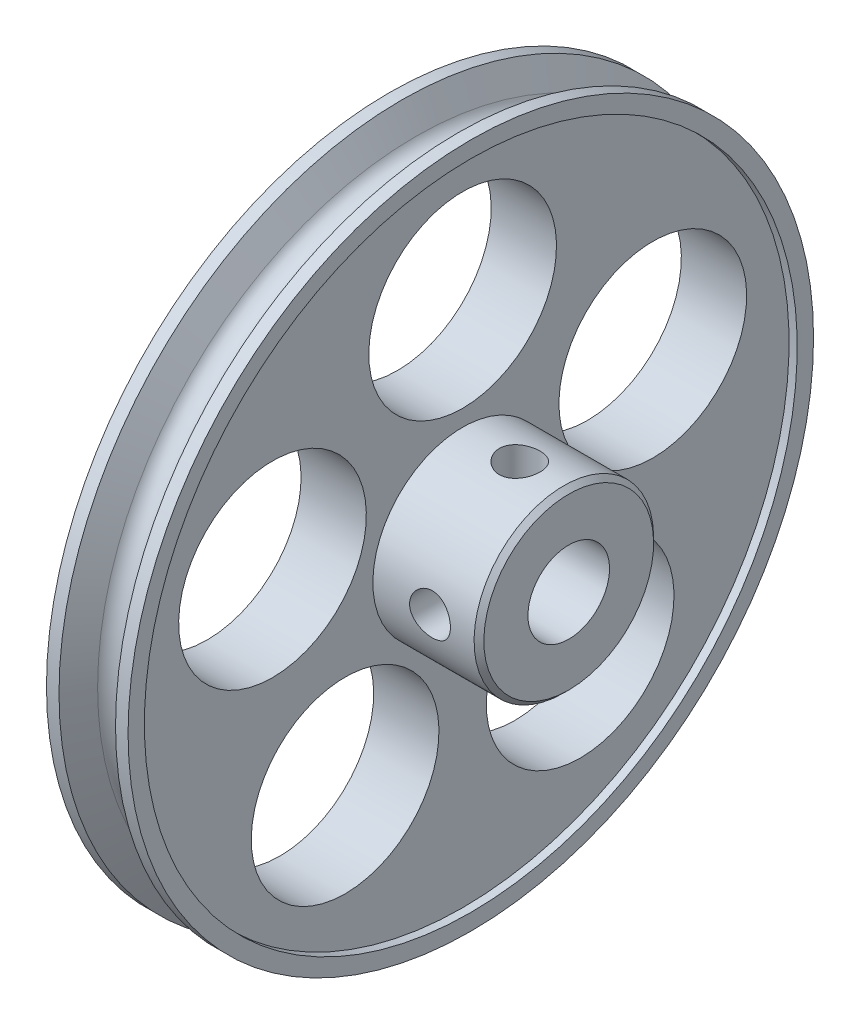
ISO-10303-21;
HEADER;
FILE_DESCRIPTION(('STEP AP214'),'2;1');
FILE_NAME('part.step','',(''),(''),'','','');
FILE_SCHEMA(('AUTOMOTIVE_DESIGN { 1 0 10303 214 1 1 1 1 }'));
ENDSEC;
DATA;
#1=APPLICATION_CONTEXT('core data for automotive mechanical design processes');
#2=APPLICATION_PROTOCOL_DEFINITION('international standard','automotive_design',2000,#1);
#3=PRODUCT_CONTEXT('',#1,'mechanical');
#4=PRODUCT('Part','Part','',(#3));
#5=PRODUCT_RELATED_PRODUCT_CATEGORY('part','',(#4));
#6=PRODUCT_DEFINITION_FORMATION('','',#4);
#7=PRODUCT_DEFINITION_CONTEXT('part definition',#1,'design');
#8=PRODUCT_DEFINITION('design','',#6,#7);
#9=PRODUCT_DEFINITION_SHAPE('','',#8);
#10=(LENGTH_UNIT() NAMED_UNIT(*) SI_UNIT(.MILLI.,.METRE.));
#11=(NAMED_UNIT(*) PLANE_ANGLE_UNIT() SI_UNIT($,.RADIAN.));
#12=(NAMED_UNIT(*) SI_UNIT($,.STERADIAN.) SOLID_ANGLE_UNIT());
#13=UNCERTAINTY_MEASURE_WITH_UNIT(LENGTH_MEASURE(1.E-05),#10,'distance_accuracy_value','');
#14=(GEOMETRIC_REPRESENTATION_CONTEXT(3) GLOBAL_UNCERTAINTY_ASSIGNED_CONTEXT((#13)) GLOBAL_UNIT_ASSIGNED_CONTEXT((#10,
#11,#12)) REPRESENTATION_CONTEXT('',''));
#15=CARTESIAN_POINT('',(0.,0.,0.));
#16=DIRECTION('',(0.,0.,1.));
#17=DIRECTION('',(1.,0.,0.));
#18=AXIS2_PLACEMENT_3D('',#15,#16,#17);
#19=CARTESIAN_POINT('',(8.5,0.,0.));
#20=DIRECTION('',(-1.,0.,0.));
#21=DIRECTION('',(0.,-1.,0.));
#22=AXIS2_PLACEMENT_3D('',#19,#20,#21);
#23=CYLINDRICAL_SURFACE('',#22,2.5);
#24=CARTESIAN_POINT('',(8.5,0.,0.));
#25=DIRECTION('',(-1.,0.,0.));
#26=DIRECTION('',(0.,-1.,0.));
#27=AXIS2_PLACEMENT_3D('',#24,#25,#26);
#28=CIRCLE('',#27,2.5);
#29=CARTESIAN_POINT('',(8.5,-2.5,0.));
#30=VERTEX_POINT('',#29);
#31=EDGE_CURVE('E182',#30,#30,#28,.T.);
#32=ORIENTED_EDGE('',*,*,#31,.F.);
#33=EDGE_LOOP('',(#32));
#34=FACE_BOUND('',#33,.T.);
#35=CARTESIAN_POINT('',(5.5,-1.25,2.1650635094611));
#36=CARTESIAN_POINT('',(5.56513476024406,-1.24999545384316,2.16506918410574));
#37=CARTESIAN_POINT('',(5.63035176440631,-1.24487496341652,2.16804751484696));
#38=CARTESIAN_POINT('',(5.75878408084644,-1.22465401237256,2.17952958065065));
#39=CARTESIAN_POINT('',(5.82199489380426,-1.20953258069272,2.18804492569449));
#40=CARTESIAN_POINT('',(5.94431458042992,-1.17012493587476,2.20936683256748));
#41=CARTESIAN_POINT('',(6.00344331559198,-1.14588744061716,2.22215054341565));
#42=CARTESIAN_POINT('',(6.1167802524959,-1.08908440672046,2.25053331021072));
#43=CARTESIAN_POINT('',(6.17098818782807,-1.05651841754471,2.26613251845081));
#44=CARTESIAN_POINT('',(6.27788216069688,-0.980833175663591,2.29996086321802));
#45=CARTESIAN_POINT('',(6.33007391959193,-0.93706504517971,2.31830079547442));
#46=CARTESIAN_POINT('',(6.42676048550839,-0.841567259518084,2.35464978482132));
#47=CARTESIAN_POINT('',(6.4712514532294,-0.789833657227862,2.37265867289062));
#48=CARTESIAN_POINT('',(6.55420893893458,-0.675611954268177,2.40776846191186));
#49=CARTESIAN_POINT('',(6.59206720982441,-0.612633986265716,2.42472633022716));
#50=CARTESIAN_POINT('',(6.6564260665572,-0.480196283249378,2.45438445124411));
#51=CARTESIAN_POINT('',(6.68293382017146,-0.410740672672691,2.46708738979677));
#52=CARTESIAN_POINT('',(6.72188082662637,-0.272556179907468,2.48600576555296));
#53=CARTESIAN_POINT('',(6.73518690794442,-0.20412723811102,2.49261850276115));
#54=CARTESIAN_POINT('',(6.7502076483438,-0.0657132858723101,2.50009479807584));
#55=CARTESIAN_POINT('',(6.75192932099463,0.00427075730467289,2.50096183480737));
#56=CARTESIAN_POINT('',(6.74406665753706,0.137290655529688,2.49703727395562));
#57=CARTESIAN_POINT('',(6.73545248059847,0.20040149897099,2.492731198652));
#58=CARTESIAN_POINT('',(6.70889894511918,0.324142214897902,2.47967806574684));
#59=CARTESIAN_POINT('',(6.69095888877972,0.384771901367405,2.47093067582992));
#60=CARTESIAN_POINT('',(6.64614679238773,0.502886739461941,2.44964479109568));
#61=CARTESIAN_POINT('',(6.61915460853492,0.560316779393975,2.43705551911499));
#62=CARTESIAN_POINT('',(6.55717072974813,0.669971001891661,2.40922057483359));
#63=CARTESIAN_POINT('',(6.52217617087205,0.722193311048303,2.39397395196855));
#64=CARTESIAN_POINT('',(6.44138081058372,0.82521707612274,2.36055492999037));
#65=CARTESIAN_POINT('',(6.39487121459248,0.875417593786703,2.34224219997719));
#66=CARTESIAN_POINT('',(6.29426284383728,0.967630462872227,2.30567925733514));
#67=CARTESIAN_POINT('',(6.24015828465742,1.00963651446778,2.28742910332036));
#68=CARTESIAN_POINT('',(6.12168975946988,1.08688166830276,2.25180195115606));
#69=CARTESIAN_POINT('',(6.05689247118223,1.12152164372257,2.23455399988384));
#70=CARTESIAN_POINT('',(5.92132791080125,1.17914889125154,2.2046931284822));
#71=CARTESIAN_POINT('',(5.85056695872804,1.2021483227636,2.19207537557584));
#72=CARTESIAN_POINT('',(5.71098186089651,1.23397526378129,2.17430794771293));
#73=CARTESIAN_POINT('',(5.64244860119556,1.24378140264997,2.1686456981062));
#74=CARTESIAN_POINT('',(5.50449832310433,1.25189618326428,2.16397399202012));
#75=CARTESIAN_POINT('',(5.43508196360027,1.25021294664377,2.1649598361164));
#76=CARTESIAN_POINT('',(5.30543260177659,1.23629505417995,2.17292920675731));
#77=CARTESIAN_POINT('',(5.24502568611509,1.22523477089058,2.17924484383318));
#78=CARTESIAN_POINT('',(5.1270402671613,1.19462035579055,2.19617526939176));
#79=CARTESIAN_POINT('',(5.06946268656675,1.17506347327951,2.20679145006292));
#80=CARTESIAN_POINT('',(4.95573583637164,1.1270594857561,2.23170277599571));
#81=CARTESIAN_POINT('',(4.89977622893306,1.09824257961591,2.24614554053829));
#82=CARTESIAN_POINT('',(4.79316341057626,1.03285883001976,2.27695149371562));
#83=CARTESIAN_POINT('',(4.7425129456084,0.996288005415264,2.29331566693935));
#84=CARTESIAN_POINT('',(4.64127654059557,0.911046458998559,2.3285999807042));
#85=CARTESIAN_POINT('',(4.59150356160293,0.861431590393709,2.34758228942861));
#86=CARTESIAN_POINT('',(4.50073470250801,0.754255619247863,2.38417793722366));
#87=CARTESIAN_POINT('',(4.45974178721183,0.696691843319179,2.40179081259637));
#88=CARTESIAN_POINT('',(4.38678284256238,0.57316920319844,2.43426702113696));
#89=CARTESIAN_POINT('',(4.35508360223636,0.50702887196764,2.44904552090037));
#90=CARTESIAN_POINT('',(4.30357762017826,0.369402955801353,2.47354193699126));
#91=CARTESIAN_POINT('',(4.28376043579213,0.297922126740217,2.48326429595466));
#92=CARTESIAN_POINT('',(4.25828929478168,0.158724602913017,2.49584385227353));
#93=CARTESIAN_POINT('',(4.25150265515486,0.091264304813068,2.49924909885239));
#94=CARTESIAN_POINT('',(4.248945918182,-0.0439074824390061,2.50052662968914));
#95=CARTESIAN_POINT('',(4.25317196434555,-0.111618875368859,2.49840085083612));
#96=CARTESIAN_POINT('',(4.27177050849454,-0.240672490396436,2.48917461047403));
#97=CARTESIAN_POINT('',(4.28545606157209,-0.302140397264083,2.48241118334987));
#98=CARTESIAN_POINT('',(4.32165874912871,-0.421807440229524,2.46490117079279));
#99=CARTESIAN_POINT('',(4.34417715011683,-0.480006106194384,2.45415401415994));
#100=CARTESIAN_POINT('',(4.39840881520748,-0.594279257806104,2.4290741343515));
#101=CARTESIAN_POINT('',(4.4304741540098,-0.65015642837506,2.41460771498499));
#102=CARTESIAN_POINT('',(4.50244741357381,-0.755968302267532,2.38360166427283));
#103=CARTESIAN_POINT('',(4.5423589363946,-0.805900259268631,2.36706108197951));
#104=CARTESIAN_POINT('',(4.63349642377838,-0.90364250519611,2.33160762783285));
#105=CARTESIAN_POINT('',(4.68545310934649,-0.950747105674091,2.31262248764622));
#106=CARTESIAN_POINT('',(4.79681340141221,-1.03582910924334,2.27578845203565));
#107=CARTESIAN_POINT('',(4.85622352608461,-1.07379843751257,2.25794057202332));
#108=CARTESIAN_POINT('',(4.9832958082262,-1.14053884973206,2.22499506631145));
#109=CARTESIAN_POINT('',(5.05115941391092,-1.16898133245118,2.21000217820338));
#110=CARTESIAN_POINT('',(5.19166550542473,-1.21359838688301,2.1858269541044));
#111=CARTESIAN_POINT('',(5.26429111114087,-1.22981398896917,2.17662520184628));
#112=CARTESIAN_POINT('',(5.364756694565,-1.24295875983051,2.16911590752238));
#113=CARTESIAN_POINT('',(5.39170986799736,-1.24559513120481,2.1676016125644));
#114=CARTESIAN_POINT('',(5.44577060085281,-1.24911675636245,2.16557419859688));
#115=CARTESIAN_POINT('',(5.47287817048234,-1.25000189299984,2.16506114656387));
#116=CARTESIAN_POINT('',(5.5,-1.25,2.1650635094611));
#117=B_SPLINE_CURVE_WITH_KNOTS('',3,(#35,#36,#37,#38,#39,#40,#41,#42,#43,#44,#45,#46,#47,#48,
#49,#50,#51,#52,#53,#54,#55,#56,#57,#58,#59,#60,#61,#62,#63,#64,#65,#66,#67,#68,#69,#70,#71,#72,
#73,#74,#75,#76,#77,#78,#79,#80,#81,#82,#83,#84,#85,#86,#87,#88,#89,#90,#91,#92,#93,#94,#95,#96,
#97,#98,#99,#100,#101,#102,#103,#104,#105,#106,#107,#108,#109,#110,#111,#112,#113,#114,#115,
#116),.UNSPECIFIED.,.T.,.F.,(4,2,2,2,2,2,2,2,2,2,2,2,2,2,2,2,2,2,2,2,2,2,2,2,2,2,2,2,2,2,2,2,2,
2,2,2,2,2,2,2,4),(0.,0.195290153243393,0.390991116031006,0.585660744898607,0.780340906806437,
0.991077890622793,1.20191963855464,1.42697365298454,1.65188533704864,1.86079356209919,
2.0695752960755,2.26020121855672,2.45084140646818,2.64411918413933,2.83746624187839,
3.04908989321113,3.26087560307398,3.4861105216181,3.7111096776463,3.91827863567764,
4.12530116485465,4.3096772928003,4.49411315545077,4.68709120507608,4.88016857775057,
5.09758429475765,5.31507331222751,5.53830226766206,5.76133474760963,5.96390337986857,
6.16640108492463,6.35555531089364,6.54473666890015,6.74200938399338,6.93937287625897,
7.15637802312582,7.3735742855644,7.59763436298254,7.82093916253448,7.90225168981635,
7.98356965618173),.UNSPECIFIED.);
#118=CARTESIAN_POINT('',(5.5,-1.25,2.1650635094611));
#119=VERTEX_POINT('',#118);
#120=EDGE_CURVE('E187',#119,#119,#117,.T.);
#121=ORIENTED_EDGE('',*,*,#120,.T.);
#122=EDGE_LOOP('',(#121));
#123=FACE_BOUND('',#122,.T.);
#124=CARTESIAN_POINT('',(5.5,2.1650635094611,1.24999999999998));
#125=CARTESIAN_POINT('',(5.56513476024406,2.16506918410575,1.24999545384314));
#126=CARTESIAN_POINT('',(5.63035176440631,2.16804751484696,1.24487496341651));
#127=CARTESIAN_POINT('',(5.75878408084644,2.17952958065066,1.22465401237256));
#128=CARTESIAN_POINT('',(5.82199489380426,2.1880449256945,1.20953258069271));
#129=CARTESIAN_POINT('',(5.94431458042992,2.20936683256749,1.17012493587475));
#130=CARTESIAN_POINT('',(6.00344331559199,2.22215054341566,1.14588744061715));
#131=CARTESIAN_POINT('',(6.1167802524959,2.25053331021073,1.08908440672046));
#132=CARTESIAN_POINT('',(6.17098818782807,2.26613251845081,1.0565184175447));
#133=CARTESIAN_POINT('',(6.27788216069688,2.29996086321802,0.980833175663582));
#134=CARTESIAN_POINT('',(6.33007391959193,2.31830079547442,0.937065045179701));
#135=CARTESIAN_POINT('',(6.42676048550839,2.35464978482132,0.841567259518075));
#136=CARTESIAN_POINT('',(6.4712514532294,2.37265867289063,0.789833657227853));
#137=CARTESIAN_POINT('',(6.55420893893458,2.40776846191187,0.675611954268168));
#138=CARTESIAN_POINT('',(6.59206720982441,2.42472633022716,0.612633986265706));
#139=CARTESIAN_POINT('',(6.6564260665572,2.45438445124411,0.480196283249368));
#140=CARTESIAN_POINT('',(6.68293382017146,2.46708738979677,0.410740672672682));
#141=CARTESIAN_POINT('',(6.72188082662637,2.48600576555297,0.272556179907459));
#142=CARTESIAN_POINT('',(6.73518690794442,2.49261850276115,0.204127238111011));
#143=CARTESIAN_POINT('',(6.7502076483438,2.50009479807584,0.0657132858723005));
#144=CARTESIAN_POINT('',(6.75192932099463,2.50096183480737,-0.00427075730468263));
#145=CARTESIAN_POINT('',(6.74406665753706,2.49703727395562,-0.137290655529697));
#146=CARTESIAN_POINT('',(6.73545248059847,2.492731198652,-0.200401498971));
#147=CARTESIAN_POINT('',(6.70889894511918,2.47967806574684,-0.324142214897912));
#148=CARTESIAN_POINT('',(6.69095888877972,2.47093067582992,-0.384771901367415));
#149=CARTESIAN_POINT('',(6.64614679238773,2.44964479109568,-0.502886739461951));
#150=CARTESIAN_POINT('',(6.61915460853492,2.43705551911499,-0.560316779393984));
#151=CARTESIAN_POINT('',(6.55717072974813,2.40922057483359,-0.66997100189167));
#152=CARTESIAN_POINT('',(6.52217617087205,2.39397395196855,-0.722193311048313));
#153=CARTESIAN_POINT('',(6.44138081058372,2.36055492999036,-0.82521707612275));
#154=CARTESIAN_POINT('',(6.39487121459248,2.34224219997718,-0.875417593786712));
#155=CARTESIAN_POINT('',(6.29426284383728,2.30567925733514,-0.967630462872235));
#156=CARTESIAN_POINT('',(6.24015828465741,2.28742910332036,-1.00963651446779));
#157=CARTESIAN_POINT('',(6.12168975946988,2.25180195115606,-1.08688166830277));
#158=CARTESIAN_POINT('',(6.05689247118223,2.23455399988384,-1.12152164372257));
#159=CARTESIAN_POINT('',(5.92132791080125,2.20469312848219,-1.17914889125155));
#160=CARTESIAN_POINT('',(5.85056695872804,2.19207537557584,-1.20214832276361));
#161=CARTESIAN_POINT('',(5.71098186089651,2.17430794771292,-1.2339752637813));
#162=CARTESIAN_POINT('',(5.64244860119556,2.1686456981062,-1.24378140264998));
#163=CARTESIAN_POINT('',(5.50449832310433,2.16397399202011,-1.25189618326429));
#164=CARTESIAN_POINT('',(5.43508196360027,2.16495983611639,-1.25021294664378));
#165=CARTESIAN_POINT('',(5.30543260177659,2.17292920675731,-1.23629505417996));
#166=CARTESIAN_POINT('',(5.24502568611509,2.17924484383317,-1.22523477089059));
#167=CARTESIAN_POINT('',(5.12704026716131,2.19617526939176,-1.19462035579056));
#168=CARTESIAN_POINT('',(5.06946268656675,2.20679145006292,-1.17506347327952));
#169=CARTESIAN_POINT('',(4.95573583637163,2.2317027759957,-1.12705948575611));
#170=CARTESIAN_POINT('',(4.89977622893306,2.24614554053829,-1.09824257961591));
#171=CARTESIAN_POINT('',(4.79316341057625,2.27695149371562,-1.03285883001976));
#172=CARTESIAN_POINT('',(4.7425129456084,2.29331566693934,-0.996288005415273));
#173=CARTESIAN_POINT('',(4.64127654059556,2.3285999807042,-0.911046458998568));
#174=CARTESIAN_POINT('',(4.59150356160292,2.34758228942861,-0.861431590393714));
#175=CARTESIAN_POINT('',(4.50073470250801,2.38417793722365,-0.754255619247868));
#176=CARTESIAN_POINT('',(4.45974178721183,2.40179081259636,-0.696691843319187));
#177=CARTESIAN_POINT('',(4.38678284256238,2.43426702113696,-0.573169203198449));
#178=CARTESIAN_POINT('',(4.35508360223636,2.44904552090036,-0.507028871967647));
#179=CARTESIAN_POINT('',(4.30357762017826,2.47354193699126,-0.36940295580136));
#180=CARTESIAN_POINT('',(4.28376043579213,2.48326429595466,-0.297922126740225));
#181=CARTESIAN_POINT('',(4.25828929478168,2.49584385227353,-0.158724602913026));
#182=CARTESIAN_POINT('',(4.25150265515486,2.49924909885239,-0.0912643048130772));
#183=CARTESIAN_POINT('',(4.248945918182,2.50052662968914,0.043907482438997));
#184=CARTESIAN_POINT('',(4.25317196434555,2.49840085083612,0.11161887536885));
#185=CARTESIAN_POINT('',(4.27177050849454,2.48917461047403,0.240672490396427));
#186=CARTESIAN_POINT('',(4.28545606157209,2.48241118334987,0.302140397264074));
#187=CARTESIAN_POINT('',(4.32165874912871,2.46490117079279,0.421807440229515));
#188=CARTESIAN_POINT('',(4.34417715011683,2.45415401415995,0.480006106194376));
#189=CARTESIAN_POINT('',(4.39840881520748,2.4290741343515,0.594279257806097));
#190=CARTESIAN_POINT('',(4.4304741540098,2.41460771498499,0.650156428375053));
#191=CARTESIAN_POINT('',(4.50244741357381,2.38360166427283,0.755968302267525));
#192=CARTESIAN_POINT('',(4.5423589363946,2.36706108197951,0.805900259268623));
#193=CARTESIAN_POINT('',(4.63349642377839,2.33160762783285,0.903642505196103));
#194=CARTESIAN_POINT('',(4.68545310934649,2.31262248764623,0.950747105674083));
#195=CARTESIAN_POINT('',(4.79681340141221,2.27578845203566,1.03582910924334));
#196=CARTESIAN_POINT('',(4.85622352608461,2.25794057202332,1.07379843751256));
#197=CARTESIAN_POINT('',(4.9832958082262,2.22499506631145,1.14053884973206));
#198=CARTESIAN_POINT('',(5.05115941391092,2.21000217820338,1.16898133245117));
#199=CARTESIAN_POINT('',(5.19166550542473,2.1858269541044,1.213598386883));
#200=CARTESIAN_POINT('',(5.26429111114087,2.17662520184628,1.22981398896916));
#201=CARTESIAN_POINT('',(5.364756694565,2.16911590752239,1.24295875983051));
#202=CARTESIAN_POINT('',(5.39170986799736,2.1676016125644,1.24559513120481));
#203=CARTESIAN_POINT('',(5.44577060085281,2.16557419859688,1.24911675636245));
#204=CARTESIAN_POINT('',(5.47287817048234,2.16506114656387,1.25000189299983));
#205=CARTESIAN_POINT('',(5.5,2.1650635094611,1.24999999999998));
#206=B_SPLINE_CURVE_WITH_KNOTS('',3,(#124,#125,#126,#127,#128,#129,#130,#131,#132,#133,#134,
#135,#136,#137,#138,#139,#140,#141,#142,#143,#144,#145,#146,#147,#148,#149,#150,#151,#152,#153,
#154,#155,#156,#157,#158,#159,#160,#161,#162,#163,#164,#165,#166,#167,#168,#169,#170,#171,#172,
#173,#174,#175,#176,#177,#178,#179,#180,#181,#182,#183,#184,#185,#186,#187,#188,#189,#190,#191,
#192,#193,#194,#195,#196,#197,#198,#199,#200,#201,#202,#203,#204,#205),.UNSPECIFIED.,.T.,.F.,(4,
2,2,2,2,2,2,2,2,2,2,2,2,2,2,2,2,2,2,2,2,2,2,2,2,2,2,2,2,2,2,2,2,2,2,2,2,2,2,2,4),(0.,
0.195290153243394,0.390991116031006,0.585660744898608,0.780340906806437,0.991077890622793,
1.20191963855464,1.42697365298454,1.65188533704864,1.86079356209919,2.0695752960755,
2.26020121855672,2.45084140646818,2.64411918413933,2.8374662418784,3.04908989321113,
3.26087560307398,3.4861105216181,3.7111096776463,3.91827863567764,4.12530116485465,
4.3096772928003,4.49411315545077,4.68709120507608,4.88016857775058,5.09758429475765,
5.31507331222752,5.53830226766206,5.76133474760963,5.96390337986857,6.16640108492463,
6.35555531089364,6.54473666890015,6.74200938399338,6.93937287625897,7.15637802312583,
7.37357428556441,7.59763436298254,7.82093916253449,7.90225168981635,7.98356965618173),.UNSPECIFIED.);
#207=CARTESIAN_POINT('',(5.5,2.1650635094611,1.24999999999998));
#208=VERTEX_POINT('',#207);
#209=EDGE_CURVE('E87',#208,#208,#206,.T.);
#210=ORIENTED_EDGE('',*,*,#209,.T.);
#211=EDGE_LOOP('',(#210));
#212=FACE_BOUND('',#211,.T.);
#213=CARTESIAN_POINT('',(-2.,0.,0.));
#214=DIRECTION('',(-1.,0.,0.));
#215=DIRECTION('',(0.,-1.,0.));
#216=AXIS2_PLACEMENT_3D('',#213,#214,#215);
#217=CIRCLE('',#216,2.5);
#218=CARTESIAN_POINT('',(-2.,-2.5,0.));
#219=VERTEX_POINT('',#218);
#220=EDGE_CURVE('E69',#219,#219,#217,.F.);
#221=ORIENTED_EDGE('',*,*,#220,.F.);
#222=EDGE_LOOP('',(#221));
#223=FACE_BOUND('',#222,.T.);
#224=ADVANCED_FACE('F17',(#34,#123,#212,#223),#23,.F.);
#225=CARTESIAN_POINT('',(8.5,2.5,0.));
#226=DIRECTION('',(-1.,0.,0.));
#227=DIRECTION('',(0.,-1.,0.));
#228=AXIS2_PLACEMENT_3D('',#225,#226,#227);
#229=PLANE('',#228);
#230=CARTESIAN_POINT('',(8.5,0.,0.));
#231=DIRECTION('',(-1.,0.,0.));
#232=DIRECTION('',(0.,-1.,0.));
#233=AXIS2_PLACEMENT_3D('',#230,#231,#232);
#234=CIRCLE('',#233,5.2);
#235=CARTESIAN_POINT('',(8.5,-5.2,0.));
#236=VERTEX_POINT('',#235);
#237=EDGE_CURVE('E25',#236,#236,#234,.F.);
#238=ORIENTED_EDGE('',*,*,#237,.T.);
#239=EDGE_LOOP('',(#238));
#240=FACE_BOUND('',#239,.T.);
#241=ORIENTED_EDGE('',*,*,#31,.T.);
#242=EDGE_LOOP('',(#241));
#243=FACE_BOUND('',#242,.T.);
#244=ADVANCED_FACE('F127',(#240,#243),#229,.F.);
#245=CARTESIAN_POINT('',(5.5,0.,10.));
#246=DIRECTION('',(0.,0.,1.));
#247=DIRECTION('',(0.,-1.,0.));
#248=AXIS2_PLACEMENT_3D('',#245,#246,#247);
#249=CYLINDRICAL_SURFACE('',#248,1.25);
#250=ORIENTED_EDGE('',*,*,#120,.F.);
#251=EDGE_LOOP('',(#250));
#252=FACE_BOUND('',#251,.T.);
#253=CARTESIAN_POINT('',(5.5,-1.25,5.35607132140714));
#254=CARTESIAN_POINT('',(5.43076690452368,-1.24999771619423,5.35607271569806));
#255=CARTESIAN_POINT('',(5.36150695883166,-1.24422856166962,5.35742832363105));
#256=CARTESIAN_POINT('',(5.22496171247158,-1.22133260118391,5.36269332424885));
#257=CARTESIAN_POINT('',(5.15767779923269,-1.20419800533182,5.3666044684747));
#258=CARTESIAN_POINT('',(5.02707947081334,-1.15914270188604,5.3765152232523));
#259=CARTESIAN_POINT('',(4.96376059770754,-1.13123436986438,5.38251243679928));
#260=CARTESIAN_POINT('',(4.84270080015933,-1.0654598749522,5.39591668787014));
#261=CARTESIAN_POINT('',(4.78495985422093,-1.0275937504387,5.4033237199606));
#262=CARTESIAN_POINT('',(4.67564225956456,-0.942242640179421,5.41886390208649));
#263=CARTESIAN_POINT('',(4.62418210979473,-0.89461022010112,5.42700696073142));
#264=CARTESIAN_POINT('',(4.5299087474454,-0.791396730287183,5.44301514430799));
#265=CARTESIAN_POINT('',(4.48709624080283,-0.735815012255046,5.45088024650588));
#266=CARTESIAN_POINT('',(4.41086847586398,-0.61749510642217,5.465554705025));
#267=CARTESIAN_POINT('',(4.37756589978466,-0.554682564129415,5.47235100492417));
#268=CARTESIAN_POINT('',(4.32203329079345,-0.424171927818222,5.48400988207614));
#269=CARTESIAN_POINT('',(4.29980191443483,-0.35647442771226,5.48887269393571));
#270=CARTESIAN_POINT('',(4.26741095212561,-0.219327796948697,5.49604666041602));
#271=CARTESIAN_POINT('',(4.25705401132126,-0.149927493751897,5.49839948403379));
#272=CARTESIAN_POINT('',(4.2480882334594,-0.0103372295205219,5.50043296396436));
#273=CARTESIAN_POINT('',(4.24947794986704,0.0598526332211511,5.50011394929908));
#274=CARTESIAN_POINT('',(4.26382036428674,0.197666935456022,5.49687132737987));
#275=CARTESIAN_POINT('',(4.27656026400688,0.265314815812266,5.4939956555269));
#276=CARTESIAN_POINT('',(4.31290153982572,0.39748651557918,5.48601775047252));
#277=CARTESIAN_POINT('',(4.33650343189669,0.462010186421011,5.48091541149934));
#278=CARTESIAN_POINT('',(4.39408270493357,0.586684721878419,5.46898135914979));
#279=CARTESIAN_POINT('',(4.42813945036789,0.646797621996538,5.46213648824824));
#280=CARTESIAN_POINT('',(4.50560225597795,0.760531999783081,5.44746585730485));
#281=CARTESIAN_POINT('',(4.54900968379099,0.814152526078438,5.43963995384659));
#282=CARTESIAN_POINT('',(4.64509570783166,0.914646772136768,5.42365855332192));
#283=CARTESIAN_POINT('',(4.6979605054002,0.961342074892393,5.41549960097905));
#284=CARTESIAN_POINT('',(4.81085540786871,1.04523960036566,5.39993520224881));
#285=CARTESIAN_POINT('',(4.87088573955754,1.08244152250121,5.39252977972439));
#286=CARTESIAN_POINT('',(4.99671199405487,1.14638443688917,5.37930083956819));
#287=CARTESIAN_POINT('',(5.0625268769599,1.17308932984505,5.37348280157186));
#288=CARTESIAN_POINT('',(5.19787427686965,1.21500479464696,5.36416156133669));
#289=CARTESIAN_POINT('',(5.26740614954766,1.23021735177407,5.36065795929618));
#290=CARTESIAN_POINT('',(5.40657712383093,1.24843460096687,5.35644447103176));
#291=CARTESIAN_POINT('',(5.47618031640686,1.25170012601047,5.35567490508626));
#292=CARTESIAN_POINT('',(5.61493660407264,1.24663886357908,5.35685524946336));
#293=CARTESIAN_POINT('',(5.6840897323738,1.2383129414362,5.35880495678505));
#294=CARTESIAN_POINT('',(5.81905914690419,1.21053208830858,5.36514758668856));
#295=CARTESIAN_POINT('',(5.88490708340292,1.19122293373319,5.36950848562745));
#296=CARTESIAN_POINT('',(6.01243279621537,1.14218254768222,5.38015285157009));
#297=CARTESIAN_POINT('',(6.07411014683461,1.11245025421961,5.38643651447105));
#298=CARTESIAN_POINT('',(6.19266651951967,1.04284048047498,5.40034808671371));
#299=CARTESIAN_POINT('',(6.24944946952045,1.00280355444638,5.40799648335529));
#300=CARTESIAN_POINT('',(6.35558665162302,0.913927790878069,5.42372272229399));
#301=CARTESIAN_POINT('',(6.40493988225933,0.865087768698983,5.43180062228642));
#302=CARTESIAN_POINT('',(6.49584054900791,0.758807449059138,5.44767387128745));
#303=CARTESIAN_POINT('',(6.53720946236039,0.70121287661363,5.45546017266619));
#304=CARTESIAN_POINT('',(6.60968540715252,0.579740838143497,5.46970150039047));
#305=CARTESIAN_POINT('',(6.64079293678277,0.515863677334325,5.47615659136063));
#306=CARTESIAN_POINT('',(6.69162020553997,0.384052524657951,5.48697029299492));
#307=CARTESIAN_POINT('',(6.71141516369946,0.316148723135448,5.49134271843123));
#308=CARTESIAN_POINT('',(6.73928827367715,0.177868141541239,5.49755837946589));
#309=CARTESIAN_POINT('',(6.74736827233215,0.107491753059365,5.49940201371996));
#310=CARTESIAN_POINT('',(6.75149355808595,-0.0320463213642784,5.50033936514418));
#311=CARTESIAN_POINT('',(6.74780453925297,-0.101199876219377,5.49949379441287));
#312=CARTESIAN_POINT('',(6.72909452566095,-0.237873894864678,5.49527900805599));
#313=CARTESIAN_POINT('',(6.71407376701105,-0.305394392651149,5.49190984501223));
#314=CARTESIAN_POINT('',(6.67325818039426,-0.436661017109415,5.48303224132098));
#315=CARTESIAN_POINT('',(6.64750377744901,-0.500420291420024,5.47753183277209));
#316=CARTESIAN_POINT('',(6.5859903865702,-0.622746579339579,5.46497684589025));
#317=CARTESIAN_POINT('',(6.55023034615724,-0.681313045870215,5.4579221040757));
#318=CARTESIAN_POINT('',(6.46886901767744,-0.792878151421584,5.44284675668577));
#319=CARTESIAN_POINT('',(6.42308254279711,-0.845739490733953,5.43480943945445));
#320=CARTESIAN_POINT('',(6.32333801485541,-0.943119149893,5.41876069975522));
#321=CARTESIAN_POINT('',(6.26937797272355,-0.987635433020147,5.41074928407657));
#322=CARTESIAN_POINT('',(6.15386400307735,-1.06769503602716,5.39552746381206));
#323=CARTESIAN_POINT('',(6.09221014351548,-1.10309689858482,5.38833055874737));
#324=CARTESIAN_POINT('',(5.96367557431419,-1.16298018793326,5.37572512012673));
#325=CARTESIAN_POINT('',(5.89679918299464,-1.1874705270155,5.3703151279975));
#326=CARTESIAN_POINT('',(5.77491602127444,-1.22064955230648,5.36285672020334));
#327=CARTESIAN_POINT('',(5.72055191371569,-1.23163414148621,5.36032965084644));
#328=CARTESIAN_POINT('',(5.61079756409272,-1.24631007168687,5.35693644077947));
#329=CARTESIAN_POINT('',(5.55540738060232,-1.25000182773419,5.35607020555341));
#330=CARTESIAN_POINT('',(5.5,-1.25,5.35607132140714));
#331=B_SPLINE_CURVE_WITH_KNOTS('',3,(#253,#254,#255,#256,#257,#258,#259,#260,#261,#262,#263,
#264,#265,#266,#267,#268,#269,#270,#271,#272,#273,#274,#275,#276,#277,#278,#279,#280,#281,#282,
#283,#284,#285,#286,#287,#288,#289,#290,#291,#292,#293,#294,#295,#296,#297,#298,#299,#300,#301,
#302,#303,#304,#305,#306,#307,#308,#309,#310,#311,#312,#313,#314,#315,#316,#317,#318,#319,#320,
#321,#322,#323,#324,#325,#326,#327,#328,#329,#330),.UNSPECIFIED.,.T.,.F.,(4,2,2,2,2,2,2,2,2,2,2,
2,2,2,2,2,2,2,2,2,2,2,2,2,2,2,2,2,2,2,2,2,2,2,2,2,2,2,4),(0.,0.207496121650814,
0.415134608622387,0.622535291788397,0.829935175650527,1.04073318636022,1.2515483982898,
1.46476669375054,1.67795910969756,1.88755439091892,2.0971238620348,2.3028450333366,
2.50857597792603,2.71590898418403,2.92327233572578,3.13528932547436,3.34731302733211,
3.5600596298443,3.77276947234059,3.98080665115181,4.18882830027155,4.39415131138951,
4.59949524842833,4.80823060479209,5.01699407183281,5.22998962990619,5.44297484551385,
5.65452690065784,5.86604560147263,6.07282318924713,6.27959646870455,6.48559793754364,
6.69162108354878,6.90183008119013,7.11209031646657,7.32544005280886,7.53861520890218,
7.70468420860326,7.87074375724419),.UNSPECIFIED.);
#332=CARTESIAN_POINT('',(5.5,-1.25,5.35607132140714));
#333=VERTEX_POINT('',#332);
#334=EDGE_CURVE('E79',#333,#333,#331,.T.);
#335=ORIENTED_EDGE('',*,*,#334,.F.);
#336=EDGE_LOOP('',(#335));
#337=FACE_BOUND('',#336,.T.);
#338=ADVANCED_FACE('F93',(#252,#337),#249,.F.);
#339=CARTESIAN_POINT('',(5.5,10.,0.));
#340=DIRECTION('',(0.,1.,0.));
#341=DIRECTION('',(0.,0.,1.));
#342=AXIS2_PLACEMENT_3D('',#339,#340,#341);
#343=CYLINDRICAL_SURFACE('',#342,1.25);
#344=ORIENTED_EDGE('',*,*,#209,.F.);
#345=EDGE_LOOP('',(#344));
#346=FACE_BOUND('',#345,.T.);
#347=CARTESIAN_POINT('',(5.5,5.35607132140714,1.24999999999997));
#348=CARTESIAN_POINT('',(5.43076690452368,5.35607271569806,1.2499977161942));
#349=CARTESIAN_POINT('',(5.36150695883166,5.35742832363105,1.2442285616696));
#350=CARTESIAN_POINT('',(5.22496171247158,5.36269332424885,1.22133260118389));
#351=CARTESIAN_POINT('',(5.15767779923269,5.3666044684747,1.2041980053318));
#352=CARTESIAN_POINT('',(5.02707947081334,5.3765152232523,1.15914270188602));
#353=CARTESIAN_POINT('',(4.96376059770754,5.38251243679928,1.13123436986436));
#354=CARTESIAN_POINT('',(4.84270080015933,5.39591668787015,1.06545987495218));
#355=CARTESIAN_POINT('',(4.78495985422093,5.4033237199606,1.02759375043868));
#356=CARTESIAN_POINT('',(4.67564225956456,5.41886390208649,0.942242640179402));
#357=CARTESIAN_POINT('',(4.62418210979473,5.42700696073142,0.894610220101101));
#358=CARTESIAN_POINT('',(4.5299087474454,5.44301514430799,0.791396730287164));
#359=CARTESIAN_POINT('',(4.48709624080283,5.45088024650588,0.735815012255027));
#360=CARTESIAN_POINT('',(4.41086847586398,5.465554705025,0.617495106422151));
#361=CARTESIAN_POINT('',(4.37756589978466,5.47235100492417,0.554682564129396));
#362=CARTESIAN_POINT('',(4.32203329079345,5.48400988207614,0.424171927818202));
#363=CARTESIAN_POINT('',(4.29980191443483,5.48887269393571,0.35647442771224));
#364=CARTESIAN_POINT('',(4.26741095212561,5.49604666041602,0.219327796948676));
#365=CARTESIAN_POINT('',(4.25705401132126,5.49839948403379,0.149927493751877));
#366=CARTESIAN_POINT('',(4.2480882334594,5.50043296396436,0.0103372295205013));
#367=CARTESIAN_POINT('',(4.24947794986704,5.50011394929908,-0.0598526332211721));
#368=CARTESIAN_POINT('',(4.26382036428675,5.49687132737987,-0.197666935456042));
#369=CARTESIAN_POINT('',(4.27656026400688,5.4939956555269,-0.265314815812286));
#370=CARTESIAN_POINT('',(4.31290153982572,5.48601775047251,-0.3974865155792));
#371=CARTESIAN_POINT('',(4.33650343189668,5.48091541149934,-0.462010186421032));
#372=CARTESIAN_POINT('',(4.39408270493356,5.4689813591498,-0.586684721878439));
#373=CARTESIAN_POINT('',(4.42813945036788,5.46213648824824,-0.646797621996557));
#374=CARTESIAN_POINT('',(4.50560225597795,5.44746585730485,-0.760531999783099));
#375=CARTESIAN_POINT('',(4.54900968379099,5.43963995384658,-0.814152526078458));
#376=CARTESIAN_POINT('',(4.64509570783166,5.42365855332191,-0.914646772136789));
#377=CARTESIAN_POINT('',(4.6979605054002,5.41549960097904,-0.961342074892414));
#378=CARTESIAN_POINT('',(4.81085540786871,5.39993520224881,-1.04523960036568));
#379=CARTESIAN_POINT('',(4.87088573955754,5.39252977972438,-1.08244152250123));
#380=CARTESIAN_POINT('',(4.99671199405487,5.37930083956818,-1.14638443688919));
#381=CARTESIAN_POINT('',(5.0625268769599,5.37348280157186,-1.17308932984507));
#382=CARTESIAN_POINT('',(5.19787427686966,5.36416156133669,-1.21500479464698));
#383=CARTESIAN_POINT('',(5.26740614954766,5.36065795929617,-1.23021735177409));
#384=CARTESIAN_POINT('',(5.40657712383093,5.35644447103175,-1.24843460096689));
#385=CARTESIAN_POINT('',(5.47618031640687,5.35567490508625,-1.25170012601049));
#386=CARTESIAN_POINT('',(5.61493660407264,5.35685524946335,-1.2466388635791));
#387=CARTESIAN_POINT('',(5.6840897323738,5.35880495678504,-1.23831294143622));
#388=CARTESIAN_POINT('',(5.81905914690419,5.36514758668855,-1.2105320883086));
#389=CARTESIAN_POINT('',(5.88490708340291,5.36950848562745,-1.19122293373321));
#390=CARTESIAN_POINT('',(6.01243279621537,5.38015285157009,-1.14218254768224));
#391=CARTESIAN_POINT('',(6.07411014683461,5.38643651447105,-1.11245025421963));
#392=CARTESIAN_POINT('',(6.19266651951967,5.40034808671371,-1.042840480475));
#393=CARTESIAN_POINT('',(6.24944946952045,5.40799648335529,-1.0028035544464));
#394=CARTESIAN_POINT('',(6.35558665162301,5.42372272229398,-0.913927790878088));
#395=CARTESIAN_POINT('',(6.40493988225933,5.43180062228641,-0.865087768699002));
#396=CARTESIAN_POINT('',(6.49584054900791,5.44767387128744,-0.758807449059157));
#397=CARTESIAN_POINT('',(6.53720946236039,5.45546017266618,-0.701212876613649));
#398=CARTESIAN_POINT('',(6.60968540715252,5.46970150039047,-0.579740838143517));
#399=CARTESIAN_POINT('',(6.64079293678277,5.47615659136062,-0.515863677334344));
#400=CARTESIAN_POINT('',(6.69162020553997,5.48697029299491,-0.38405252465797));
#401=CARTESIAN_POINT('',(6.71141516369945,5.49134271843123,-0.316148723135467));
#402=CARTESIAN_POINT('',(6.73928827367715,5.49755837946588,-0.177868141541258));
#403=CARTESIAN_POINT('',(6.74736827233215,5.49940201371995,-0.107491753059384));
#404=CARTESIAN_POINT('',(6.75149355808595,5.50033936514417,0.0320463213642598));
#405=CARTESIAN_POINT('',(6.74780453925297,5.49949379441287,0.101199876219358));
#406=CARTESIAN_POINT('',(6.72909452566095,5.495279008056,0.237873894864659));
#407=CARTESIAN_POINT('',(6.71407376701105,5.49190984501223,0.305394392651131));
#408=CARTESIAN_POINT('',(6.67325818039426,5.48303224132098,0.436661017109397));
#409=CARTESIAN_POINT('',(6.64750377744901,5.47753183277209,0.500420291420006));
#410=CARTESIAN_POINT('',(6.5859903865702,5.46497684589026,0.622746579339561));
#411=CARTESIAN_POINT('',(6.55023034615724,5.45792210407571,0.681313045870197));
#412=CARTESIAN_POINT('',(6.46886901767744,5.44284675668578,0.792878151421566));
#413=CARTESIAN_POINT('',(6.42308254279711,5.43480943945445,0.845739490733934));
#414=CARTESIAN_POINT('',(6.32333801485541,5.41876069975522,0.943119149892982));
#415=CARTESIAN_POINT('',(6.26937797272355,5.41074928407657,0.987635433020131));
#416=CARTESIAN_POINT('',(6.15386400307735,5.39552746381206,1.06769503602715));
#417=CARTESIAN_POINT('',(6.09221014351547,5.38833055874737,1.1030968985848));
#418=CARTESIAN_POINT('',(5.96367557431419,5.37572512012673,1.16298018793324));
#419=CARTESIAN_POINT('',(5.89679918299464,5.37031512799751,1.18747052701548));
#420=CARTESIAN_POINT('',(5.77491602127444,5.36285672020335,1.22064955230646));
#421=CARTESIAN_POINT('',(5.72055191371569,5.36032965084645,1.2316341414862));
#422=CARTESIAN_POINT('',(5.61079756409272,5.35693644077948,1.24631007168685));
#423=CARTESIAN_POINT('',(5.55540738060232,5.35607020555341,1.25000182773416));
#424=CARTESIAN_POINT('',(5.5,5.35607132140714,1.24999999999997));
#425=B_SPLINE_CURVE_WITH_KNOTS('',3,(#347,#348,#349,#350,#351,#352,#353,#354,#355,#356,#357,
#358,#359,#360,#361,#362,#363,#364,#365,#366,#367,#368,#369,#370,#371,#372,#373,#374,#375,#376,
#377,#378,#379,#380,#381,#382,#383,#384,#385,#386,#387,#388,#389,#390,#391,#392,#393,#394,#395,
#396,#397,#398,#399,#400,#401,#402,#403,#404,#405,#406,#407,#408,#409,#410,#411,#412,#413,#414,
#415,#416,#417,#418,#419,#420,#421,#422,#423,#424),.UNSPECIFIED.,.T.,.F.,(4,2,2,2,2,2,2,2,2,2,2,
2,2,2,2,2,2,2,2,2,2,2,2,2,2,2,2,2,2,2,2,2,2,2,2,2,2,2,4),(0.,0.207496121650814,
0.415134608622386,0.622535291788397,0.829935175650526,1.04073318636021,1.25154839828979,
1.46476669375054,1.67795910969756,1.88755439091892,2.0971238620348,2.3028450333366,
2.50857597792602,2.71590898418403,2.92327233572578,3.13528932547436,3.34731302733211,
3.5600596298443,3.77276947234059,3.98080665115181,4.18882830027155,4.39415131138951,
4.59949524842833,4.80823060479209,5.01699407183282,5.22998962990619,5.44297484551385,
5.65452690065784,5.86604560147263,6.07282318924713,6.27959646870455,6.48559793754364,
6.69162108354878,6.90183008119013,7.11209031646658,7.32544005280887,7.53861520890218,
7.70468420860326,7.87074375724419),.UNSPECIFIED.);
#426=CARTESIAN_POINT('',(5.5,5.35607132140714,1.24999999999997));
#427=VERTEX_POINT('',#426);
#428=EDGE_CURVE('E78',#427,#427,#425,.T.);
#429=ORIENTED_EDGE('',*,*,#428,.F.);
#430=EDGE_LOOP('',(#429));
#431=FACE_BOUND('',#430,.T.);
#432=ADVANCED_FACE('F112',(#346,#431),#343,.F.);
#433=CARTESIAN_POINT('',(8.5,0.,0.));
#434=DIRECTION('',(-1.,0.,0.));
#435=DIRECTION('',(0.,-1.,0.));
#436=AXIS2_PLACEMENT_3D('',#433,#434,#435);
#437=CYLINDRICAL_SURFACE('',#436,21.);
#438=CARTESIAN_POINT('',(-2.5,0.,0.));
#439=DIRECTION('',(-1.,0.,0.));
#440=DIRECTION('',(0.,-1.,0.));
#441=AXIS2_PLACEMENT_3D('',#438,#439,#440);
#442=CIRCLE('',#441,21.);
#443=CARTESIAN_POINT('',(-2.5,-21.,0.));
#444=VERTEX_POINT('',#443);
#445=EDGE_CURVE('E185',#444,#444,#442,.T.);
#446=ORIENTED_EDGE('',*,*,#445,.F.);
#447=EDGE_LOOP('',(#446));
#448=FACE_BOUND('',#447,.T.);
#449=CARTESIAN_POINT('',(-1.73205080756884,0.,0.));
#450=DIRECTION('',(-1.,0.,0.));
#451=DIRECTION('',(0.,-1.,0.));
#452=AXIS2_PLACEMENT_3D('',#449,#450,#451);
#453=CIRCLE('',#452,21.);
#454=CARTESIAN_POINT('',(-1.73205080756884,-21.,0.));
#455=VERTEX_POINT('',#454);
#456=EDGE_CURVE('E30',#455,#455,#453,.T.);
#457=ORIENTED_EDGE('',*,*,#456,.T.);
#458=EDGE_LOOP('',(#457));
#459=FACE_BOUND('',#458,.T.);
#460=ADVANCED_FACE('F115',(#448,#459),#437,.T.);
#461=CARTESIAN_POINT('',(-0.866025403784448,0.,0.));
#462=DIRECTION('',(-1.,0.,0.));
#463=DIRECTION('',(0.,-1.,0.));
#464=AXIS2_PLACEMENT_3D('',#461,#462,#463);
#465=CONICAL_SURFACE('',#464,19.5,1.04719755119662);
#466=ORIENTED_EDGE('',*,*,#456,.F.);
#467=EDGE_LOOP('',(#466));
#468=FACE_BOUND('',#467,.T.);
#469=CARTESIAN_POINT('',(-0.866025403784448,0.,0.));
#470=DIRECTION('',(-1.,0.,0.));
#471=DIRECTION('',(0.,-1.,0.));
#472=AXIS2_PLACEMENT_3D('',#469,#470,#471);
#473=CIRCLE('',#472,19.5);
#474=CARTESIAN_POINT('',(-0.866025403784449,-19.5,0.));
#475=VERTEX_POINT('',#474);
#476=EDGE_CURVE('E171',#475,#475,#473,.T.);
#477=ORIENTED_EDGE('',*,*,#476,.T.);
#478=EDGE_LOOP('',(#477));
#479=FACE_BOUND('',#478,.T.);
#480=ADVANCED_FACE('F125',(#468,#479),#465,.T.);
#481=CARTESIAN_POINT('',(0.,0.,0.));
#482=DIRECTION('',(-1.,0.,0.));
#483=DIRECTION('',(0.,-1.,0.));
#484=AXIS2_PLACEMENT_3D('',#481,#482,#483);
#485=TOROIDAL_SURFACE('',#484,20.,1.);
#486=ORIENTED_EDGE('',*,*,#476,.F.);
#487=EDGE_LOOP('',(#486));
#488=FACE_BOUND('',#487,.T.);
#489=CARTESIAN_POINT('',(0.866025403784446,0.,0.));
#490=DIRECTION('',(-1.,0.,0.));
#491=DIRECTION('',(0.,-1.,0.));
#492=AXIS2_PLACEMENT_3D('',#489,#490,#491);
#493=CIRCLE('',#492,19.5);
#494=CARTESIAN_POINT('',(0.866025403784445,-19.5,0.));
#495=VERTEX_POINT('',#494);
#496=EDGE_CURVE('E172',#495,#495,#493,.T.);
#497=ORIENTED_EDGE('',*,*,#496,.T.);
#498=EDGE_LOOP('',(#497));
#499=FACE_BOUND('',#498,.T.);
#500=ADVANCED_FACE('F156',(#488,#499),#485,.F.);
#501=CARTESIAN_POINT('',(1.73205080756883,0.,0.));
#502=DIRECTION('',(1.,0.,0.));
#503=DIRECTION('',(0.,1.,0.));
#504=AXIS2_PLACEMENT_3D('',#501,#502,#503);
#505=CONICAL_SURFACE('',#504,21.,1.04719755119662);
#506=ORIENTED_EDGE('',*,*,#496,.F.);
#507=EDGE_LOOP('',(#506));
#508=FACE_BOUND('',#507,.T.);
#509=CARTESIAN_POINT('',(1.73205080756883,0.,0.));
#510=DIRECTION('',(-1.,0.,0.));
#511=DIRECTION('',(0.,-1.,0.));
#512=AXIS2_PLACEMENT_3D('',#509,#510,#511);
#513=CIRCLE('',#512,21.);
#514=CARTESIAN_POINT('',(1.73205080756883,-21.,0.));
#515=VERTEX_POINT('',#514);
#516=EDGE_CURVE('E174',#515,#515,#513,.T.);
#517=ORIENTED_EDGE('',*,*,#516,.T.);
#518=EDGE_LOOP('',(#517));
#519=FACE_BOUND('',#518,.T.);
#520=ADVANCED_FACE('F152',(#508,#519),#505,.T.);
#521=CARTESIAN_POINT('',(8.5,0.,0.));
#522=DIRECTION('',(-1.,0.,0.));
#523=DIRECTION('',(0.,-1.,0.));
#524=AXIS2_PLACEMENT_3D('',#521,#522,#523);
#525=CYLINDRICAL_SURFACE('',#524,21.);
#526=ORIENTED_EDGE('',*,*,#516,.F.);
#527=EDGE_LOOP('',(#526));
#528=FACE_BOUND('',#527,.T.);
#529=CARTESIAN_POINT('',(2.5,0.,0.));
#530=DIRECTION('',(-1.,0.,0.));
#531=DIRECTION('',(0.,-1.,0.));
#532=AXIS2_PLACEMENT_3D('',#529,#530,#531);
#533=CIRCLE('',#532,21.);
#534=CARTESIAN_POINT('',(2.5,-21.,0.));
#535=VERTEX_POINT('',#534);
#536=EDGE_CURVE('E179',#535,#535,#533,.T.);
#537=ORIENTED_EDGE('',*,*,#536,.T.);
#538=EDGE_LOOP('',(#537));
#539=FACE_BOUND('',#538,.T.);
#540=ADVANCED_FACE('F148',(#528,#539),#525,.T.);
#541=CARTESIAN_POINT('',(2.5,10.,0.));
#542=DIRECTION('',(-1.,0.,0.));
#543=DIRECTION('',(0.,-1.,0.));
#544=AXIS2_PLACEMENT_3D('',#541,#542,#543);
#545=PLANE('',#544);
#546=CARTESIAN_POINT('',(2.5,0.,0.));
#547=DIRECTION('',(-1.,0.,0.));
#548=DIRECTION('',(0.,-1.,0.));
#549=AXIS2_PLACEMENT_3D('',#546,#547,#548);
#550=CIRCLE('',#549,20.);
#551=CARTESIAN_POINT('',(2.5,-20.,0.));
#552=VERTEX_POINT('',#551);
#553=EDGE_CURVE('E86',#552,#552,#550,.T.);
#554=ORIENTED_EDGE('',*,*,#553,.T.);
#555=EDGE_LOOP('',(#554));
#556=FACE_BOUND('',#555,.T.);
#557=ORIENTED_EDGE('',*,*,#536,.F.);
#558=EDGE_LOOP('',(#557));
#559=FACE_BOUND('',#558,.T.);
#560=ADVANCED_FACE('F145',(#556,#559),#545,.F.);
#561=CARTESIAN_POINT('',(-2.5,21.,0.));
#562=DIRECTION('',(1.,0.,0.));
#563=DIRECTION('',(0.,1.,0.));
#564=AXIS2_PLACEMENT_3D('',#561,#562,#563);
#565=PLANE('',#564);
#566=CARTESIAN_POINT('',(-2.5,0.,0.));
#567=DIRECTION('',(-1.,0.,0.));
#568=DIRECTION('',(0.,-1.,0.));
#569=AXIS2_PLACEMENT_3D('',#566,#567,#568);
#570=CIRCLE('',#569,20.);
#571=CARTESIAN_POINT('',(-2.5,-20.,0.));
#572=VERTEX_POINT('',#571);
#573=EDGE_CURVE('E65',#572,#572,#570,.T.);
#574=ORIENTED_EDGE('',*,*,#573,.F.);
#575=EDGE_LOOP('',(#574));
#576=FACE_BOUND('',#575,.T.);
#577=ORIENTED_EDGE('',*,*,#445,.T.);
#578=EDGE_LOOP('',(#577));
#579=FACE_BOUND('',#578,.T.);
#580=ADVANCED_FACE('F143',(#576,#579),#565,.F.);
#581=CARTESIAN_POINT('',(-55.0685424949238,0.,0.));
#582=DIRECTION('',(1.,0.,0.));
#583=DIRECTION('',(0.,1.,0.));
#584=AXIS2_PLACEMENT_3D('',#581,#582,#583);
#585=CYLINDRICAL_SURFACE('',#584,20.);
#586=CARTESIAN_POINT('',(2.,0.,0.));
#587=DIRECTION('',(-1.,0.,0.));
#588=DIRECTION('',(0.,-1.,0.));
#589=AXIS2_PLACEMENT_3D('',#586,#587,#588);
#590=CIRCLE('',#589,20.);
#591=CARTESIAN_POINT('',(2.,-20.,0.));
#592=VERTEX_POINT('',#591);
#593=EDGE_CURVE('E72',#592,#592,#590,.F.);
#594=ORIENTED_EDGE('',*,*,#593,.F.);
#595=EDGE_LOOP('',(#594));
#596=FACE_BOUND('',#595,.T.);
#597=ORIENTED_EDGE('',*,*,#553,.F.);
#598=EDGE_LOOP('',(#597));
#599=FACE_BOUND('',#598,.T.);
#600=ADVANCED_FACE('F102',(#596,#599),#585,.F.);
#601=CARTESIAN_POINT('',(-55.0685424949238,0.,0.));
#602=DIRECTION('',(1.,0.,0.));
#603=DIRECTION('',(0.,1.,0.));
#604=AXIS2_PLACEMENT_3D('',#601,#602,#603);
#605=CYLINDRICAL_SURFACE('',#604,5.5);
#606=CARTESIAN_POINT('',(8.2,0.,0.));
#607=DIRECTION('',(-1.,0.,0.));
#608=DIRECTION('',(0.,-1.,0.));
#609=AXIS2_PLACEMENT_3D('',#606,#607,#608);
#610=CIRCLE('',#609,5.5);
#611=CARTESIAN_POINT('',(8.2,-5.5,0.));
#612=VERTEX_POINT('',#611);
#613=EDGE_CURVE('E11',#612,#612,#610,.T.);
#614=ORIENTED_EDGE('',*,*,#613,.T.);
#615=EDGE_LOOP('',(#614));
#616=FACE_BOUND('',#615,.T.);
#617=ORIENTED_EDGE('',*,*,#428,.T.);
#618=EDGE_LOOP('',(#617));
#619=FACE_BOUND('',#618,.T.);
#620=CARTESIAN_POINT('',(2.,0.,0.));
#621=DIRECTION('',(-1.,0.,0.));
#622=DIRECTION('',(0.,-1.,0.));
#623=AXIS2_PLACEMENT_3D('',#620,#621,#622);
#624=CIRCLE('',#623,5.5);
#625=CARTESIAN_POINT('',(2.,-5.5,0.));
#626=VERTEX_POINT('',#625);
#627=EDGE_CURVE('E75',#626,#626,#624,.F.);
#628=ORIENTED_EDGE('',*,*,#627,.T.);
#629=EDGE_LOOP('',(#628));
#630=FACE_BOUND('',#629,.T.);
#631=ORIENTED_EDGE('',*,*,#334,.T.);
#632=EDGE_LOOP('',(#631));
#633=FACE_BOUND('',#632,.T.);
#634=ADVANCED_FACE('F96',(#616,#619,#630,#633),#605,.T.);
#635=CARTESIAN_POINT('',(2.,10.,0.));
#636=DIRECTION('',(-1.,0.,0.));
#637=DIRECTION('',(0.,-1.,0.));
#638=AXIS2_PLACEMENT_3D('',#635,#636,#637);
#639=PLANE('',#638);
#640=CARTESIAN_POINT('',(2.,3.78545818109324,11.6504423246156));
#641=DIRECTION('',(-1.,0.,0.));
#642=DIRECTION('',(0.,-1.,0.));
#643=AXIS2_PLACEMENT_3D('',#640,#641,#642);
#644=CIRCLE('',#643,5.75);
#645=CARTESIAN_POINT('',(2.,-1.96454181890676,11.6504423246156));
#646=VERTEX_POINT('',#645);
#647=EDGE_CURVE('E48',#646,#646,#644,.T.);
#648=ORIENTED_EDGE('',*,*,#647,.T.);
#649=EDGE_LOOP('',(#648));
#650=FACE_BOUND('',#649,.T.);
#651=CARTESIAN_POINT('',(2.,-9.91045818109304,7.20036934058288));
#652=DIRECTION('',(-1.,0.,0.));
#653=DIRECTION('',(0.,-1.,0.));
#654=AXIS2_PLACEMENT_3D('',#651,#652,#653);
#655=CIRCLE('',#654,5.75);
#656=CARTESIAN_POINT('',(2.,-15.660458181093,7.20036934058288));
#657=VERTEX_POINT('',#656);
#658=EDGE_CURVE('E45',#657,#657,#655,.T.);
#659=ORIENTED_EDGE('',*,*,#658,.T.);
#660=EDGE_LOOP('',(#659));
#661=FACE_BOUND('',#660,.T.);
#662=CARTESIAN_POINT('',(2.,-9.91045818109315,-7.20036934058274));
#663=DIRECTION('',(-1.,0.,0.));
#664=DIRECTION('',(0.,-1.,0.));
#665=AXIS2_PLACEMENT_3D('',#662,#663,#664);
#666=CIRCLE('',#665,5.75);
#667=CARTESIAN_POINT('',(2.,-15.6604581810931,-7.20036934058274));
#668=VERTEX_POINT('',#667);
#669=EDGE_CURVE('E42',#668,#668,#666,.T.);
#670=ORIENTED_EDGE('',*,*,#669,.T.);
#671=EDGE_LOOP('',(#670));
#672=FACE_BOUND('',#671,.T.);
#673=CARTESIAN_POINT('',(2.,3.78545818109307,-11.6504423246156));
#674=DIRECTION('',(-1.,0.,0.));
#675=DIRECTION('',(0.,-1.,0.));
#676=AXIS2_PLACEMENT_3D('',#673,#674,#675);
#677=CIRCLE('',#676,5.75);
#678=CARTESIAN_POINT('',(2.,-1.96454181890693,-11.6504423246156));
#679=VERTEX_POINT('',#678);
#680=EDGE_CURVE('E38',#679,#679,#677,.T.);
#681=ORIENTED_EDGE('',*,*,#680,.T.);
#682=EDGE_LOOP('',(#681));
#683=FACE_BOUND('',#682,.T.);
#684=CARTESIAN_POINT('',(2.,12.25,0.));
#685=DIRECTION('',(-1.,0.,0.));
#686=DIRECTION('',(0.,-1.,0.));
#687=AXIS2_PLACEMENT_3D('',#684,#685,#686);
#688=CIRCLE('',#687,5.75);
#689=CARTESIAN_POINT('',(2.,6.5,0.));
#690=VERTEX_POINT('',#689);
#691=EDGE_CURVE('E37',#690,#690,#688,.T.);
#692=ORIENTED_EDGE('',*,*,#691,.T.);
#693=EDGE_LOOP('',(#692));
#694=FACE_BOUND('',#693,.T.);
#695=ORIENTED_EDGE('',*,*,#593,.T.);
#696=EDGE_LOOP('',(#695));
#697=FACE_BOUND('',#696,.T.);
#698=ORIENTED_EDGE('',*,*,#627,.F.);
#699=EDGE_LOOP('',(#698));
#700=FACE_BOUND('',#699,.T.);
#701=ADVANCED_FACE('F101',(#650,#661,#672,#683,#694,#697,#700),#639,.F.);
#702=CARTESIAN_POINT('',(-2.,0.,0.));
#703=DIRECTION('',(-1.,0.,0.));
#704=DIRECTION('',(0.,-1.,0.));
#705=AXIS2_PLACEMENT_3D('',#702,#703,#704);
#706=PLANE('',#705);
#707=CARTESIAN_POINT('',(-2.,3.78545818109324,11.6504423246156));
#708=DIRECTION('',(-1.,0.,0.));
#709=DIRECTION('',(0.,-1.,0.));
#710=AXIS2_PLACEMENT_3D('',#707,#708,#709);
#711=CIRCLE('',#710,5.75);
#712=CARTESIAN_POINT('',(-2.,-1.96454181890676,11.6504423246156));
#713=VERTEX_POINT('',#712);
#714=EDGE_CURVE('E21',#713,#713,#711,.T.);
#715=ORIENTED_EDGE('',*,*,#714,.F.);
#716=EDGE_LOOP('',(#715));
#717=FACE_BOUND('',#716,.T.);
#718=CARTESIAN_POINT('',(-2.,-9.91045818109304,7.20036934058288));
#719=DIRECTION('',(-1.,0.,0.));
#720=DIRECTION('',(0.,-1.,0.));
#721=AXIS2_PLACEMENT_3D('',#718,#719,#720);
#722=CIRCLE('',#721,5.75);
#723=CARTESIAN_POINT('',(-2.,-15.660458181093,7.20036934058288));
#724=VERTEX_POINT('',#723);
#725=EDGE_CURVE('E46',#724,#724,#722,.T.);
#726=ORIENTED_EDGE('',*,*,#725,.F.);
#727=EDGE_LOOP('',(#726));
#728=FACE_BOUND('',#727,.T.);
#729=CARTESIAN_POINT('',(-2.,-9.91045818109315,-7.20036934058274));
#730=DIRECTION('',(-1.,0.,0.));
#731=DIRECTION('',(0.,-1.,0.));
#732=AXIS2_PLACEMENT_3D('',#729,#730,#731);
#733=CIRCLE('',#732,5.75);
#734=CARTESIAN_POINT('',(-2.,-15.6604581810931,-7.20036934058274));
#735=VERTEX_POINT('',#734);
#736=EDGE_CURVE('E43',#735,#735,#733,.T.);
#737=ORIENTED_EDGE('',*,*,#736,.F.);
#738=EDGE_LOOP('',(#737));
#739=FACE_BOUND('',#738,.T.);
#740=CARTESIAN_POINT('',(-2.,3.78545818109307,-11.6504423246156));
#741=DIRECTION('',(-1.,0.,0.));
#742=DIRECTION('',(0.,-1.,0.));
#743=AXIS2_PLACEMENT_3D('',#740,#741,#742);
#744=CIRCLE('',#743,5.75);
#745=CARTESIAN_POINT('',(-2.,-1.96454181890693,-11.6504423246156));
#746=VERTEX_POINT('',#745);
#747=EDGE_CURVE('E39',#746,#746,#744,.T.);
#748=ORIENTED_EDGE('',*,*,#747,.F.);
#749=EDGE_LOOP('',(#748));
#750=FACE_BOUND('',#749,.T.);
#751=CARTESIAN_POINT('',(-2.,12.25,0.));
#752=DIRECTION('',(-1.,0.,0.));
#753=DIRECTION('',(0.,-1.,0.));
#754=AXIS2_PLACEMENT_3D('',#751,#752,#753);
#755=CIRCLE('',#754,5.75);
#756=CARTESIAN_POINT('',(-2.,6.5,0.));
#757=VERTEX_POINT('',#756);
#758=EDGE_CURVE('E34',#757,#757,#755,.T.);
#759=ORIENTED_EDGE('',*,*,#758,.F.);
#760=EDGE_LOOP('',(#759));
#761=FACE_BOUND('',#760,.T.);
#762=CARTESIAN_POINT('',(-2.,0.,0.));
#763=DIRECTION('',(-1.,0.,0.));
#764=DIRECTION('',(0.,-1.,0.));
#765=AXIS2_PLACEMENT_3D('',#762,#763,#764);
#766=CIRCLE('',#765,20.);
#767=CARTESIAN_POINT('',(-2.,-20.,0.));
#768=VERTEX_POINT('',#767);
#769=EDGE_CURVE('E66',#768,#768,#766,.T.);
#770=ORIENTED_EDGE('',*,*,#769,.T.);
#771=EDGE_LOOP('',(#770));
#772=FACE_BOUND('',#771,.T.);
#773=ORIENTED_EDGE('',*,*,#220,.T.);
#774=EDGE_LOOP('',(#773));
#775=FACE_BOUND('',#774,.T.);
#776=ADVANCED_FACE('F210',(#717,#728,#739,#750,#761,#772,#775),#706,.T.);
#777=CARTESIAN_POINT('',(-2.,0.,0.));
#778=DIRECTION('',(-1.,0.,0.));
#779=DIRECTION('',(0.,-1.,0.));
#780=AXIS2_PLACEMENT_3D('',#777,#778,#779);
#781=CYLINDRICAL_SURFACE('',#780,20.);
#782=ORIENTED_EDGE('',*,*,#769,.F.);
#783=EDGE_LOOP('',(#782));
#784=FACE_BOUND('',#783,.T.);
#785=ORIENTED_EDGE('',*,*,#573,.T.);
#786=EDGE_LOOP('',(#785));
#787=FACE_BOUND('',#786,.T.);
#788=ADVANCED_FACE('F220',(#784,#787),#781,.F.);
#789=CARTESIAN_POINT('',(8.5,0.,0.));
#790=DIRECTION('',(-1.,0.,0.));
#791=DIRECTION('',(0.,-1.,0.));
#792=AXIS2_PLACEMENT_3D('',#789,#790,#791);
#793=CONICAL_SURFACE('',#792,5.2,0.785398163397463);
#794=ORIENTED_EDGE('',*,*,#613,.F.);
#795=EDGE_LOOP('',(#794));
#796=FACE_BOUND('',#795,.T.);
#797=ORIENTED_EDGE('',*,*,#237,.F.);
#798=EDGE_LOOP('',(#797));
#799=FACE_BOUND('',#798,.T.);
#800=ADVANCED_FACE('F19',(#796,#799),#793,.T.);
#801=CARTESIAN_POINT('',(-2.5,12.25,0.));
#802=DIRECTION('',(1.,0.,0.));
#803=DIRECTION('',(0.,1.,0.));
#804=AXIS2_PLACEMENT_3D('',#801,#802,#803);
#805=CYLINDRICAL_SURFACE('',#804,5.75);
#806=ORIENTED_EDGE('',*,*,#758,.T.);
#807=EDGE_LOOP('',(#806));
#808=FACE_BOUND('',#807,.T.);
#809=ORIENTED_EDGE('',*,*,#691,.F.);
#810=EDGE_LOOP('',(#809));
#811=FACE_BOUND('',#810,.T.);
#812=ADVANCED_FACE('F232',(#808,#811),#805,.F.);
#813=CARTESIAN_POINT('',(-2.5,3.78545818109307,-11.6504423246156));
#814=DIRECTION('',(1.,0.,0.));
#815=DIRECTION('',(0.,1.,0.));
#816=AXIS2_PLACEMENT_3D('',#813,#814,#815);
#817=CYLINDRICAL_SURFACE('',#816,5.75);
#818=ORIENTED_EDGE('',*,*,#747,.T.);
#819=EDGE_LOOP('',(#818));
#820=FACE_BOUND('',#819,.T.);
#821=ORIENTED_EDGE('',*,*,#680,.F.);
#822=EDGE_LOOP('',(#821));
#823=FACE_BOUND('',#822,.T.);
#824=ADVANCED_FACE('F234',(#820,#823),#817,.F.);
#825=CARTESIAN_POINT('',(-2.5,-9.91045818109315,-7.20036934058274));
#826=DIRECTION('',(1.,0.,0.));
#827=DIRECTION('',(0.,1.,0.));
#828=AXIS2_PLACEMENT_3D('',#825,#826,#827);
#829=CYLINDRICAL_SURFACE('',#828,5.75);
#830=ORIENTED_EDGE('',*,*,#736,.T.);
#831=EDGE_LOOP('',(#830));
#832=FACE_BOUND('',#831,.T.);
#833=ORIENTED_EDGE('',*,*,#669,.F.);
#834=EDGE_LOOP('',(#833));
#835=FACE_BOUND('',#834,.T.);
#836=ADVANCED_FACE('F242',(#832,#835),#829,.F.);
#837=CARTESIAN_POINT('',(-2.5,-9.91045818109304,7.20036934058288));
#838=DIRECTION('',(1.,0.,0.));
#839=DIRECTION('',(0.,1.,0.));
#840=AXIS2_PLACEMENT_3D('',#837,#838,#839);
#841=CYLINDRICAL_SURFACE('',#840,5.75);
#842=ORIENTED_EDGE('',*,*,#725,.T.);
#843=EDGE_LOOP('',(#842));
#844=FACE_BOUND('',#843,.T.);
#845=ORIENTED_EDGE('',*,*,#658,.F.);
#846=EDGE_LOOP('',(#845));
#847=FACE_BOUND('',#846,.T.);
#848=ADVANCED_FACE('F294',(#844,#847),#841,.F.);
#849=CARTESIAN_POINT('',(-2.5,3.78545818109324,11.6504423246156));
#850=DIRECTION('',(1.,0.,0.));
#851=DIRECTION('',(0.,1.,0.));
#852=AXIS2_PLACEMENT_3D('',#849,#850,#851);
#853=CYLINDRICAL_SURFACE('',#852,5.75);
#854=ORIENTED_EDGE('',*,*,#714,.T.);
#855=EDGE_LOOP('',(#854));
#856=FACE_BOUND('',#855,.T.);
#857=ORIENTED_EDGE('',*,*,#647,.F.);
#858=EDGE_LOOP('',(#857));
#859=FACE_BOUND('',#858,.T.);
#860=ADVANCED_FACE('F303',(#856,#859),#853,.F.);
#861=CLOSED_SHELL('',(#224,#244,#338,#432,#460,#480,#500,#520,#540,#560,#580,#600,#634,#701,
#776,#788,#800,#812,#824,#836,#848,#860));
#862=MANIFOLD_SOLID_BREP('B1',#861);
#863=ADVANCED_BREP_SHAPE_REPRESENTATION('',(#18,#862),#14);
#864=SHAPE_DEFINITION_REPRESENTATION(#9,#863);
ENDSEC;
END-ISO-10303-21;
